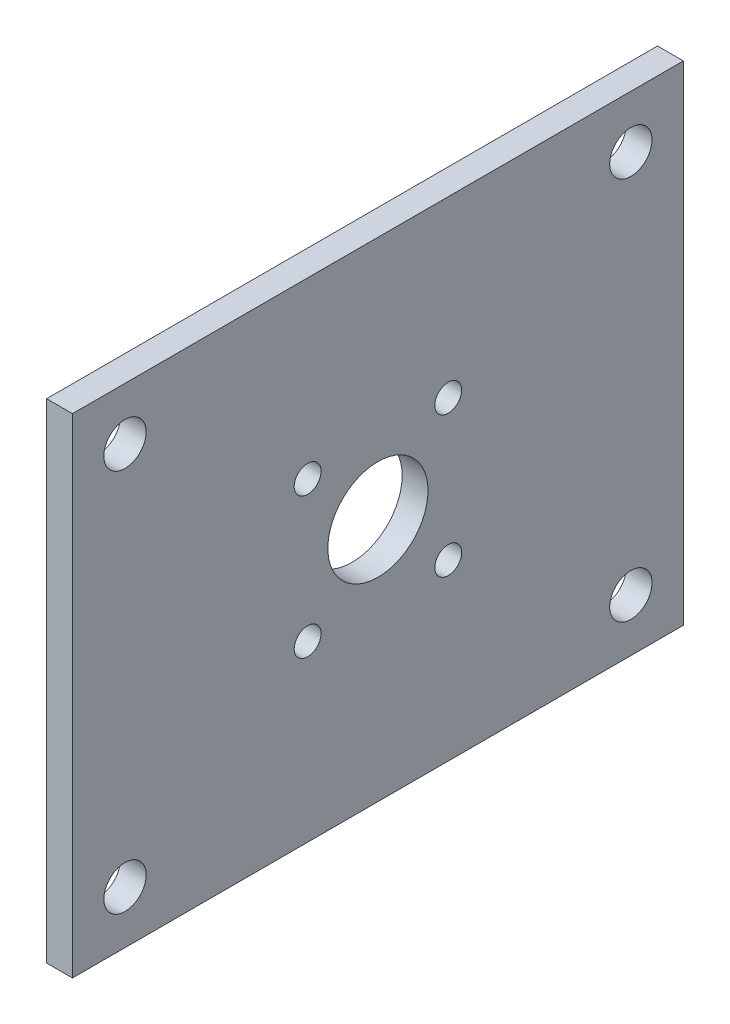
ISO-10303-21;
HEADER;
FILE_DESCRIPTION(('STEP AP214'),'2;1');
FILE_NAME('part.step','',(''),(''),'','','');
FILE_SCHEMA(('AUTOMOTIVE_DESIGN { 1 0 10303 214 1 1 1 1 }'));
ENDSEC;
DATA;
#1=APPLICATION_CONTEXT('core data for automotive mechanical design processes');
#2=APPLICATION_PROTOCOL_DEFINITION('international standard','automotive_design',2000,#1);
#3=PRODUCT_CONTEXT('',#1,'mechanical');
#4=PRODUCT('Part','Part','',(#3));
#5=PRODUCT_RELATED_PRODUCT_CATEGORY('part','',(#4));
#6=PRODUCT_DEFINITION_FORMATION('','',#4);
#7=PRODUCT_DEFINITION_CONTEXT('part definition',#1,'design');
#8=PRODUCT_DEFINITION('design','',#6,#7);
#9=PRODUCT_DEFINITION_SHAPE('','',#8);
#10=(LENGTH_UNIT() NAMED_UNIT(*) SI_UNIT(.MILLI.,.METRE.));
#11=(NAMED_UNIT(*) PLANE_ANGLE_UNIT() SI_UNIT($,.RADIAN.));
#12=(NAMED_UNIT(*) SI_UNIT($,.STERADIAN.) SOLID_ANGLE_UNIT());
#13=UNCERTAINTY_MEASURE_WITH_UNIT(LENGTH_MEASURE(1.E-05),#10,'distance_accuracy_value','');
#14=(GEOMETRIC_REPRESENTATION_CONTEXT(3) GLOBAL_UNCERTAINTY_ASSIGNED_CONTEXT((#13)) GLOBAL_UNIT_ASSIGNED_CONTEXT((#10,
#11,#12)) REPRESENTATION_CONTEXT('',''));
#15=CARTESIAN_POINT('',(0.,0.,0.));
#16=DIRECTION('',(0.,0.,1.));
#17=DIRECTION('',(1.,0.,0.));
#18=AXIS2_PLACEMENT_3D('',#15,#16,#17);
#19=CARTESIAN_POINT('',(-1.5875,-30.,-37.5));
#20=DIRECTION('',(0.,0.,-1.));
#21=DIRECTION('',(-1.,0.,0.));
#22=AXIS2_PLACEMENT_3D('',#19,#20,#21);
#23=PLANE('',#22);
#24=DIRECTION('',(1.,0.,0.));
#25=VECTOR('',#24,1.);
#26=CARTESIAN_POINT('',(-1.5875,30.,-37.5));
#27=LINE('',#26,#25);
#28=CARTESIAN_POINT('',(-1.5875,30.,-37.5));
#29=VERTEX_POINT('',#28);
#30=CARTESIAN_POINT('',(1.5875,30.,-37.5));
#31=VERTEX_POINT('',#30);
#32=EDGE_CURVE('E36',#29,#31,#27,.T.);
#33=ORIENTED_EDGE('',*,*,#32,.T.);
#34=DIRECTION('',(0.,1.,0.));
#35=VECTOR('',#34,1.);
#36=CARTESIAN_POINT('',(1.5875,-30.,-37.5));
#37=LINE('',#36,#35);
#38=CARTESIAN_POINT('',(1.5875,-30.,-37.5));
#39=VERTEX_POINT('',#38);
#40=EDGE_CURVE('E73',#39,#31,#37,.T.);
#41=ORIENTED_EDGE('',*,*,#40,.F.);
#42=DIRECTION('',(1.,0.,0.));
#43=VECTOR('',#42,1.);
#44=CARTESIAN_POINT('',(-1.5875,-30.,-37.5));
#45=LINE('',#44,#43);
#46=CARTESIAN_POINT('',(-1.5875,-30.,-37.5));
#47=VERTEX_POINT('',#46);
#48=EDGE_CURVE('E11',#47,#39,#45,.T.);
#49=ORIENTED_EDGE('',*,*,#48,.F.);
#50=DIRECTION('',(0.,1.,0.));
#51=VECTOR('',#50,1.);
#52=CARTESIAN_POINT('',(-1.5875,-30.,-37.5));
#53=LINE('',#52,#51);
#54=EDGE_CURVE('E74',#47,#29,#53,.T.);
#55=ORIENTED_EDGE('',*,*,#54,.T.);
#56=EDGE_LOOP('',(#33,#41,#49,#55));
#57=FACE_BOUND('',#56,.T.);
#58=ADVANCED_FACE('F33',(#57),#23,.T.);
#59=CARTESIAN_POINT('',(-1.5875,-30.,37.5));
#60=DIRECTION('',(0.,-1.,0.));
#61=DIRECTION('',(0.,0.,-1.));
#62=AXIS2_PLACEMENT_3D('',#59,#60,#61);
#63=PLANE('',#62);
#64=ORIENTED_EDGE('',*,*,#48,.T.);
#65=DIRECTION('',(0.,0.,-1.));
#66=VECTOR('',#65,1.);
#67=CARTESIAN_POINT('',(1.5875,-30.,37.5));
#68=LINE('',#67,#66);
#69=CARTESIAN_POINT('',(1.5875,-30.,37.5));
#70=VERTEX_POINT('',#69);
#71=EDGE_CURVE('E90',#70,#39,#68,.T.);
#72=ORIENTED_EDGE('',*,*,#71,.F.);
#73=DIRECTION('',(1.,0.,0.));
#74=VECTOR('',#73,1.);
#75=CARTESIAN_POINT('',(-1.5875,-30.,37.5));
#76=LINE('',#75,#74);
#77=CARTESIAN_POINT('',(-1.5875,-30.,37.5));
#78=VERTEX_POINT('',#77);
#79=EDGE_CURVE('E41',#78,#70,#76,.T.);
#80=ORIENTED_EDGE('',*,*,#79,.F.);
#81=DIRECTION('',(0.,0.,-1.));
#82=VECTOR('',#81,1.);
#83=CARTESIAN_POINT('',(-1.5875,-30.,37.5));
#84=LINE('',#83,#82);
#85=EDGE_CURVE('E79',#78,#47,#84,.T.);
#86=ORIENTED_EDGE('',*,*,#85,.T.);
#87=EDGE_LOOP('',(#64,#72,#80,#86));
#88=FACE_BOUND('',#87,.T.);
#89=ADVANCED_FACE('F110',(#88),#63,.T.);
#90=CARTESIAN_POINT('',(-1.5875,-30.,37.5));
#91=DIRECTION('',(0.,0.,1.));
#92=DIRECTION('',(1.,0.,0.));
#93=AXIS2_PLACEMENT_3D('',#90,#91,#92);
#94=PLANE('',#93);
#95=ORIENTED_EDGE('',*,*,#79,.T.);
#96=DIRECTION('',(0.,-1.,0.));
#97=VECTOR('',#96,1.);
#98=CARTESIAN_POINT('',(1.5875,-30.,37.5));
#99=LINE('',#98,#97);
#100=CARTESIAN_POINT('',(1.5875,30.,37.5));
#101=VERTEX_POINT('',#100);
#102=EDGE_CURVE('E86',#101,#70,#99,.T.);
#103=ORIENTED_EDGE('',*,*,#102,.F.);
#104=DIRECTION('',(1.,0.,0.));
#105=VECTOR('',#104,1.);
#106=CARTESIAN_POINT('',(-1.5875,30.,37.5));
#107=LINE('',#106,#105);
#108=CARTESIAN_POINT('',(-1.5875,30.,37.5));
#109=VERTEX_POINT('',#108);
#110=EDGE_CURVE('E78',#109,#101,#107,.T.);
#111=ORIENTED_EDGE('',*,*,#110,.F.);
#112=DIRECTION('',(0.,-1.,0.));
#113=VECTOR('',#112,1.);
#114=CARTESIAN_POINT('',(-1.5875,-30.,37.5));
#115=LINE('',#114,#113);
#116=EDGE_CURVE('E103',#109,#78,#115,.T.);
#117=ORIENTED_EDGE('',*,*,#116,.T.);
#118=EDGE_LOOP('',(#95,#103,#111,#117));
#119=FACE_BOUND('',#118,.T.);
#120=ADVANCED_FACE('F107',(#119),#94,.T.);
#121=CARTESIAN_POINT('',(-1.5875,30.,37.5));
#122=DIRECTION('',(0.,1.,0.));
#123=DIRECTION('',(0.,0.,1.));
#124=AXIS2_PLACEMENT_3D('',#121,#122,#123);
#125=PLANE('',#124);
#126=ORIENTED_EDGE('',*,*,#110,.T.);
#127=DIRECTION('',(0.,0.,1.));
#128=VECTOR('',#127,1.);
#129=CARTESIAN_POINT('',(1.5875,30.,37.5));
#130=LINE('',#129,#128);
#131=EDGE_CURVE('E81',#31,#101,#130,.T.);
#132=ORIENTED_EDGE('',*,*,#131,.F.);
#133=ORIENTED_EDGE('',*,*,#32,.F.);
#134=DIRECTION('',(0.,0.,1.));
#135=VECTOR('',#134,1.);
#136=CARTESIAN_POINT('',(-1.5875,30.,37.5));
#137=LINE('',#136,#135);
#138=EDGE_CURVE('E101',#29,#109,#137,.T.);
#139=ORIENTED_EDGE('',*,*,#138,.T.);
#140=EDGE_LOOP('',(#126,#132,#133,#139));
#141=FACE_BOUND('',#140,.T.);
#142=ADVANCED_FACE('F82',(#141),#125,.T.);
#143=CARTESIAN_POINT('',(-1.5875,0.,0.));
#144=DIRECTION('',(-1.,0.,0.));
#145=DIRECTION('',(0.,0.,1.));
#146=AXIS2_PLACEMENT_3D('',#143,#144,#145);
#147=PLANE('',#146);
#148=CARTESIAN_POINT('',(-1.5875,8.63,-8.63));
#149=DIRECTION('',(1.,0.,0.));
#150=DIRECTION('',(0.,0.,1.));
#151=AXIS2_PLACEMENT_3D('',#148,#149,#150);
#152=CIRCLE('',#151,1.65);
#153=CARTESIAN_POINT('',(-1.5875,8.63,-6.98));
#154=VERTEX_POINT('',#153);
#155=EDGE_CURVE('E245',#154,#154,#152,.T.);
#156=ORIENTED_EDGE('',*,*,#155,.T.);
#157=EDGE_LOOP('',(#156));
#158=FACE_BOUND('',#157,.T.);
#159=CARTESIAN_POINT('',(-1.5875,-8.63,-8.63));
#160=DIRECTION('',(1.,0.,0.));
#161=DIRECTION('',(0.,0.,-1.));
#162=AXIS2_PLACEMENT_3D('',#159,#160,#161);
#163=CIRCLE('',#162,1.65);
#164=CARTESIAN_POINT('',(-1.5875,-8.63,-10.28));
#165=VERTEX_POINT('',#164);
#166=EDGE_CURVE('E253',#165,#165,#163,.T.);
#167=ORIENTED_EDGE('',*,*,#166,.T.);
#168=EDGE_LOOP('',(#167));
#169=FACE_BOUND('',#168,.T.);
#170=CARTESIAN_POINT('',(-1.5875,-8.63,8.63));
#171=DIRECTION('',(1.,0.,0.));
#172=DIRECTION('',(0.,0.,1.));
#173=AXIS2_PLACEMENT_3D('',#170,#171,#172);
#174=CIRCLE('',#173,1.65);
#175=CARTESIAN_POINT('',(-1.5875,-8.63,10.28));
#176=VERTEX_POINT('',#175);
#177=EDGE_CURVE('E312',#176,#176,#174,.T.);
#178=ORIENTED_EDGE('',*,*,#177,.T.);
#179=EDGE_LOOP('',(#178));
#180=FACE_BOUND('',#179,.T.);
#181=CARTESIAN_POINT('',(-1.5875,8.63,8.63));
#182=DIRECTION('',(1.,0.,0.));
#183=DIRECTION('',(0.,0.,-1.));
#184=AXIS2_PLACEMENT_3D('',#181,#182,#183);
#185=CIRCLE('',#184,1.65);
#186=CARTESIAN_POINT('',(-1.5875,8.63,6.98));
#187=VERTEX_POINT('',#186);
#188=EDGE_CURVE('E260',#187,#187,#185,.T.);
#189=ORIENTED_EDGE('',*,*,#188,.T.);
#190=EDGE_LOOP('',(#189));
#191=FACE_BOUND('',#190,.T.);
#192=CARTESIAN_POINT('',(-1.5875,0.,0.));
#193=DIRECTION('',(1.,0.,0.));
#194=DIRECTION('',(0.,0.,-1.));
#195=AXIS2_PLACEMENT_3D('',#192,#193,#194);
#196=CIRCLE('',#195,6.15);
#197=CARTESIAN_POINT('',(-1.5875,0.,-6.15));
#198=VERTEX_POINT('',#197);
#199=EDGE_CURVE('E259',#198,#198,#196,.T.);
#200=ORIENTED_EDGE('',*,*,#199,.T.);
#201=EDGE_LOOP('',(#200));
#202=FACE_BOUND('',#201,.T.);
#203=CARTESIAN_POINT('',(-1.5875,-23.55,31.05));
#204=DIRECTION('',(1.,0.,0.));
#205=DIRECTION('',(0.,0.,1.));
#206=AXIS2_PLACEMENT_3D('',#203,#204,#205);
#207=CIRCLE('',#206,2.6);
#208=CARTESIAN_POINT('',(-1.5875,-23.55,33.65));
#209=VERTEX_POINT('',#208);
#210=EDGE_CURVE('E274',#209,#209,#207,.T.);
#211=ORIENTED_EDGE('',*,*,#210,.T.);
#212=EDGE_LOOP('',(#211));
#213=FACE_BOUND('',#212,.T.);
#214=CARTESIAN_POINT('',(-1.5875,-23.55,-31.05));
#215=DIRECTION('',(1.,0.,0.));
#216=DIRECTION('',(0.,0.,-1.));
#217=AXIS2_PLACEMENT_3D('',#214,#215,#216);
#218=CIRCLE('',#217,2.6);
#219=CARTESIAN_POINT('',(-1.5875,-23.55,-33.65));
#220=VERTEX_POINT('',#219);
#221=EDGE_CURVE('E268',#220,#220,#218,.T.);
#222=ORIENTED_EDGE('',*,*,#221,.T.);
#223=EDGE_LOOP('',(#222));
#224=FACE_BOUND('',#223,.T.);
#225=CARTESIAN_POINT('',(-1.5875,23.55,-31.05));
#226=DIRECTION('',(1.,0.,0.));
#227=DIRECTION('',(0.,0.,1.));
#228=AXIS2_PLACEMENT_3D('',#225,#226,#227);
#229=CIRCLE('',#228,2.6);
#230=CARTESIAN_POINT('',(-1.5875,23.55,-28.45));
#231=VERTEX_POINT('',#230);
#232=EDGE_CURVE('E267',#231,#231,#229,.T.);
#233=ORIENTED_EDGE('',*,*,#232,.T.);
#234=EDGE_LOOP('',(#233));
#235=FACE_BOUND('',#234,.T.);
#236=CARTESIAN_POINT('',(-1.5875,23.55,31.05));
#237=DIRECTION('',(1.,0.,0.));
#238=DIRECTION('',(0.,0.,-1.));
#239=AXIS2_PLACEMENT_3D('',#236,#237,#238);
#240=CIRCLE('',#239,2.6);
#241=CARTESIAN_POINT('',(-1.5875,23.55,28.45));
#242=VERTEX_POINT('',#241);
#243=EDGE_CURVE('E91',#242,#242,#240,.T.);
#244=ORIENTED_EDGE('',*,*,#243,.T.);
#245=EDGE_LOOP('',(#244));
#246=FACE_BOUND('',#245,.T.);
#247=ORIENTED_EDGE('',*,*,#54,.F.);
#248=ORIENTED_EDGE('',*,*,#85,.F.);
#249=ORIENTED_EDGE('',*,*,#116,.F.);
#250=ORIENTED_EDGE('',*,*,#138,.F.);
#251=EDGE_LOOP('',(#247,#248,#249,#250));
#252=FACE_BOUND('',#251,.T.);
#253=ADVANCED_FACE('F112',(#158,#169,#180,#191,#202,#213,#224,#235,#246,#252),#147,.T.);
#254=CARTESIAN_POINT('',(1.5875,0.,0.));
#255=DIRECTION('',(-1.,0.,0.));
#256=DIRECTION('',(0.,0.,1.));
#257=AXIS2_PLACEMENT_3D('',#254,#255,#256);
#258=PLANE('',#257);
#259=CARTESIAN_POINT('',(1.5875,8.63,-8.63));
#260=DIRECTION('',(1.,0.,0.));
#261=DIRECTION('',(0.,0.,1.));
#262=AXIS2_PLACEMENT_3D('',#259,#260,#261);
#263=CIRCLE('',#262,1.65);
#264=CARTESIAN_POINT('',(1.5875,8.63,-6.98));
#265=VERTEX_POINT('',#264);
#266=EDGE_CURVE('E248',#265,#265,#263,.T.);
#267=ORIENTED_EDGE('',*,*,#266,.F.);
#268=EDGE_LOOP('',(#267));
#269=FACE_BOUND('',#268,.T.);
#270=CARTESIAN_POINT('',(1.5875,-8.63,-8.63));
#271=DIRECTION('',(1.,0.,0.));
#272=DIRECTION('',(0.,0.,-1.));
#273=AXIS2_PLACEMENT_3D('',#270,#271,#272);
#274=CIRCLE('',#273,1.65);
#275=CARTESIAN_POINT('',(1.5875,-8.63,-10.28));
#276=VERTEX_POINT('',#275);
#277=EDGE_CURVE('E250',#276,#276,#274,.T.);
#278=ORIENTED_EDGE('',*,*,#277,.F.);
#279=EDGE_LOOP('',(#278));
#280=FACE_BOUND('',#279,.T.);
#281=CARTESIAN_POINT('',(1.5875,-8.63,8.63));
#282=DIRECTION('',(1.,0.,0.));
#283=DIRECTION('',(0.,0.,1.));
#284=AXIS2_PLACEMENT_3D('',#281,#282,#283);
#285=CIRCLE('',#284,1.65);
#286=CARTESIAN_POINT('',(1.5875,-8.63,10.28));
#287=VERTEX_POINT('',#286);
#288=EDGE_CURVE('E315',#287,#287,#285,.T.);
#289=ORIENTED_EDGE('',*,*,#288,.F.);
#290=EDGE_LOOP('',(#289));
#291=FACE_BOUND('',#290,.T.);
#292=CARTESIAN_POINT('',(1.5875,8.63,8.63));
#293=DIRECTION('',(1.,0.,0.));
#294=DIRECTION('',(0.,0.,-1.));
#295=AXIS2_PLACEMENT_3D('',#292,#293,#294);
#296=CIRCLE('',#295,1.65);
#297=CARTESIAN_POINT('',(1.5875,8.63,6.98));
#298=VERTEX_POINT('',#297);
#299=EDGE_CURVE('E307',#298,#298,#296,.T.);
#300=ORIENTED_EDGE('',*,*,#299,.F.);
#301=EDGE_LOOP('',(#300));
#302=FACE_BOUND('',#301,.T.);
#303=CARTESIAN_POINT('',(1.5875,0.,0.));
#304=DIRECTION('',(1.,0.,0.));
#305=DIRECTION('',(0.,0.,-1.));
#306=AXIS2_PLACEMENT_3D('',#303,#304,#305);
#307=CIRCLE('',#306,6.15);
#308=CARTESIAN_POINT('',(1.5875,0.,-6.15));
#309=VERTEX_POINT('',#308);
#310=EDGE_CURVE('E256',#309,#309,#307,.T.);
#311=ORIENTED_EDGE('',*,*,#310,.F.);
#312=EDGE_LOOP('',(#311));
#313=FACE_BOUND('',#312,.T.);
#314=CARTESIAN_POINT('',(1.5875,-23.55,31.05));
#315=DIRECTION('',(1.,0.,0.));
#316=DIRECTION('',(0.,0.,1.));
#317=AXIS2_PLACEMENT_3D('',#314,#315,#316);
#318=CIRCLE('',#317,2.6);
#319=CARTESIAN_POINT('',(1.5875,-23.55,33.65));
#320=VERTEX_POINT('',#319);
#321=EDGE_CURVE('E263',#320,#320,#318,.T.);
#322=ORIENTED_EDGE('',*,*,#321,.F.);
#323=EDGE_LOOP('',(#322));
#324=FACE_BOUND('',#323,.T.);
#325=CARTESIAN_POINT('',(1.5875,-23.55,-31.05));
#326=DIRECTION('',(1.,0.,0.));
#327=DIRECTION('',(0.,0.,-1.));
#328=AXIS2_PLACEMENT_3D('',#325,#326,#327);
#329=CIRCLE('',#328,2.6);
#330=CARTESIAN_POINT('',(1.5875,-23.55,-33.65));
#331=VERTEX_POINT('',#330);
#332=EDGE_CURVE('E271',#331,#331,#329,.T.);
#333=ORIENTED_EDGE('',*,*,#332,.F.);
#334=EDGE_LOOP('',(#333));
#335=FACE_BOUND('',#334,.T.);
#336=CARTESIAN_POINT('',(1.5875,23.55,-31.05));
#337=DIRECTION('',(1.,0.,0.));
#338=DIRECTION('',(0.,0.,1.));
#339=AXIS2_PLACEMENT_3D('',#336,#337,#338);
#340=CIRCLE('',#339,2.6);
#341=CARTESIAN_POINT('',(1.5875,23.55,-28.45));
#342=VERTEX_POINT('',#341);
#343=EDGE_CURVE('E264',#342,#342,#340,.T.);
#344=ORIENTED_EDGE('',*,*,#343,.F.);
#345=EDGE_LOOP('',(#344));
#346=FACE_BOUND('',#345,.T.);
#347=CARTESIAN_POINT('',(1.5875,23.55,31.05));
#348=DIRECTION('',(1.,0.,0.));
#349=DIRECTION('',(0.,0.,-1.));
#350=AXIS2_PLACEMENT_3D('',#347,#348,#349);
#351=CIRCLE('',#350,2.6);
#352=CARTESIAN_POINT('',(1.5875,23.55,28.45));
#353=VERTEX_POINT('',#352);
#354=EDGE_CURVE('E94',#353,#353,#351,.T.);
#355=ORIENTED_EDGE('',*,*,#354,.F.);
#356=EDGE_LOOP('',(#355));
#357=FACE_BOUND('',#356,.T.);
#358=ORIENTED_EDGE('',*,*,#40,.T.);
#359=ORIENTED_EDGE('',*,*,#131,.T.);
#360=ORIENTED_EDGE('',*,*,#102,.T.);
#361=ORIENTED_EDGE('',*,*,#71,.T.);
#362=EDGE_LOOP('',(#358,#359,#360,#361));
#363=FACE_BOUND('',#362,.T.);
#364=ADVANCED_FACE('F89',(#269,#280,#291,#302,#313,#324,#335,#346,#357,#363),#258,.F.);
#365=CARTESIAN_POINT('',(-1.5875,23.55,31.05));
#366=DIRECTION('',(1.,0.,0.));
#367=DIRECTION('',(0.,0.,-1.));
#368=AXIS2_PLACEMENT_3D('',#365,#366,#367);
#369=CYLINDRICAL_SURFACE('',#368,2.6);
#370=ORIENTED_EDGE('',*,*,#243,.F.);
#371=EDGE_LOOP('',(#370));
#372=FACE_BOUND('',#371,.T.);
#373=ORIENTED_EDGE('',*,*,#354,.T.);
#374=EDGE_LOOP('',(#373));
#375=FACE_BOUND('',#374,.T.);
#376=ADVANCED_FACE('F120',(#372,#375),#369,.F.);
#377=CARTESIAN_POINT('',(-1.5875,23.55,-31.05));
#378=DIRECTION('',(1.,0.,0.));
#379=DIRECTION('',(0.,0.,-1.));
#380=AXIS2_PLACEMENT_3D('',#377,#378,#379);
#381=CYLINDRICAL_SURFACE('',#380,2.6);
#382=ORIENTED_EDGE('',*,*,#232,.F.);
#383=EDGE_LOOP('',(#382));
#384=FACE_BOUND('',#383,.T.);
#385=ORIENTED_EDGE('',*,*,#343,.T.);
#386=EDGE_LOOP('',(#385));
#387=FACE_BOUND('',#386,.T.);
#388=ADVANCED_FACE('F150',(#384,#387),#381,.F.);
#389=CARTESIAN_POINT('',(-1.5875,-23.55,-31.05));
#390=DIRECTION('',(1.,0.,0.));
#391=DIRECTION('',(0.,0.,-1.));
#392=AXIS2_PLACEMENT_3D('',#389,#390,#391);
#393=CYLINDRICAL_SURFACE('',#392,2.6);
#394=ORIENTED_EDGE('',*,*,#221,.F.);
#395=EDGE_LOOP('',(#394));
#396=FACE_BOUND('',#395,.T.);
#397=ORIENTED_EDGE('',*,*,#332,.T.);
#398=EDGE_LOOP('',(#397));
#399=FACE_BOUND('',#398,.T.);
#400=ADVANCED_FACE('F161',(#396,#399),#393,.F.);
#401=CARTESIAN_POINT('',(-1.5875,-23.55,31.05));
#402=DIRECTION('',(1.,0.,0.));
#403=DIRECTION('',(0.,0.,-1.));
#404=AXIS2_PLACEMENT_3D('',#401,#402,#403);
#405=CYLINDRICAL_SURFACE('',#404,2.6);
#406=ORIENTED_EDGE('',*,*,#210,.F.);
#407=EDGE_LOOP('',(#406));
#408=FACE_BOUND('',#407,.T.);
#409=ORIENTED_EDGE('',*,*,#321,.T.);
#410=EDGE_LOOP('',(#409));
#411=FACE_BOUND('',#410,.T.);
#412=ADVANCED_FACE('F171',(#408,#411),#405,.F.);
#413=CARTESIAN_POINT('',(-1.5875,0.,0.));
#414=DIRECTION('',(1.,0.,0.));
#415=DIRECTION('',(0.,0.,-1.));
#416=AXIS2_PLACEMENT_3D('',#413,#414,#415);
#417=CYLINDRICAL_SURFACE('',#416,6.15);
#418=ORIENTED_EDGE('',*,*,#199,.F.);
#419=EDGE_LOOP('',(#418));
#420=FACE_BOUND('',#419,.T.);
#421=ORIENTED_EDGE('',*,*,#310,.T.);
#422=EDGE_LOOP('',(#421));
#423=FACE_BOUND('',#422,.T.);
#424=ADVANCED_FACE('F180',(#420,#423),#417,.F.);
#425=CARTESIAN_POINT('',(-1.5875,8.63,8.63));
#426=DIRECTION('',(1.,0.,0.));
#427=DIRECTION('',(0.,0.,-1.));
#428=AXIS2_PLACEMENT_3D('',#425,#426,#427);
#429=CYLINDRICAL_SURFACE('',#428,1.65);
#430=ORIENTED_EDGE('',*,*,#188,.F.);
#431=EDGE_LOOP('',(#430));
#432=FACE_BOUND('',#431,.T.);
#433=ORIENTED_EDGE('',*,*,#299,.T.);
#434=EDGE_LOOP('',(#433));
#435=FACE_BOUND('',#434,.T.);
#436=ADVANCED_FACE('F199',(#432,#435),#429,.F.);
#437=CARTESIAN_POINT('',(-1.5875,-8.63,8.63));
#438=DIRECTION('',(1.,0.,0.));
#439=DIRECTION('',(0.,0.,-1.));
#440=AXIS2_PLACEMENT_3D('',#437,#438,#439);
#441=CYLINDRICAL_SURFACE('',#440,1.65);
#442=ORIENTED_EDGE('',*,*,#177,.F.);
#443=EDGE_LOOP('',(#442));
#444=FACE_BOUND('',#443,.T.);
#445=ORIENTED_EDGE('',*,*,#288,.T.);
#446=EDGE_LOOP('',(#445));
#447=FACE_BOUND('',#446,.T.);
#448=ADVANCED_FACE('F209',(#444,#447),#441,.F.);
#449=CARTESIAN_POINT('',(-1.5875,-8.63,-8.63));
#450=DIRECTION('',(1.,0.,0.));
#451=DIRECTION('',(0.,0.,-1.));
#452=AXIS2_PLACEMENT_3D('',#449,#450,#451);
#453=CYLINDRICAL_SURFACE('',#452,1.65);
#454=ORIENTED_EDGE('',*,*,#166,.F.);
#455=EDGE_LOOP('',(#454));
#456=FACE_BOUND('',#455,.T.);
#457=ORIENTED_EDGE('',*,*,#277,.T.);
#458=EDGE_LOOP('',(#457));
#459=FACE_BOUND('',#458,.T.);
#460=ADVANCED_FACE('F219',(#456,#459),#453,.F.);
#461=CARTESIAN_POINT('',(-1.5875,8.63,-8.63));
#462=DIRECTION('',(1.,0.,0.));
#463=DIRECTION('',(0.,0.,-1.));
#464=AXIS2_PLACEMENT_3D('',#461,#462,#463);
#465=CYLINDRICAL_SURFACE('',#464,1.65);
#466=ORIENTED_EDGE('',*,*,#155,.F.);
#467=EDGE_LOOP('',(#466));
#468=FACE_BOUND('',#467,.T.);
#469=ORIENTED_EDGE('',*,*,#266,.T.);
#470=EDGE_LOOP('',(#469));
#471=FACE_BOUND('',#470,.T.);
#472=ADVANCED_FACE('F229',(#468,#471),#465,.F.);
#473=CLOSED_SHELL('',(#58,#89,#120,#142,#253,#364,#376,#388,#400,#412,#424,#436,#448,#460,#472));
#474=MANIFOLD_SOLID_BREP('B2',#473);
#475=ADVANCED_BREP_SHAPE_REPRESENTATION('',(#18,#474),#14);
#476=SHAPE_DEFINITION_REPRESENTATION(#9,#475);
ENDSEC;
END-ISO-10303-21;
